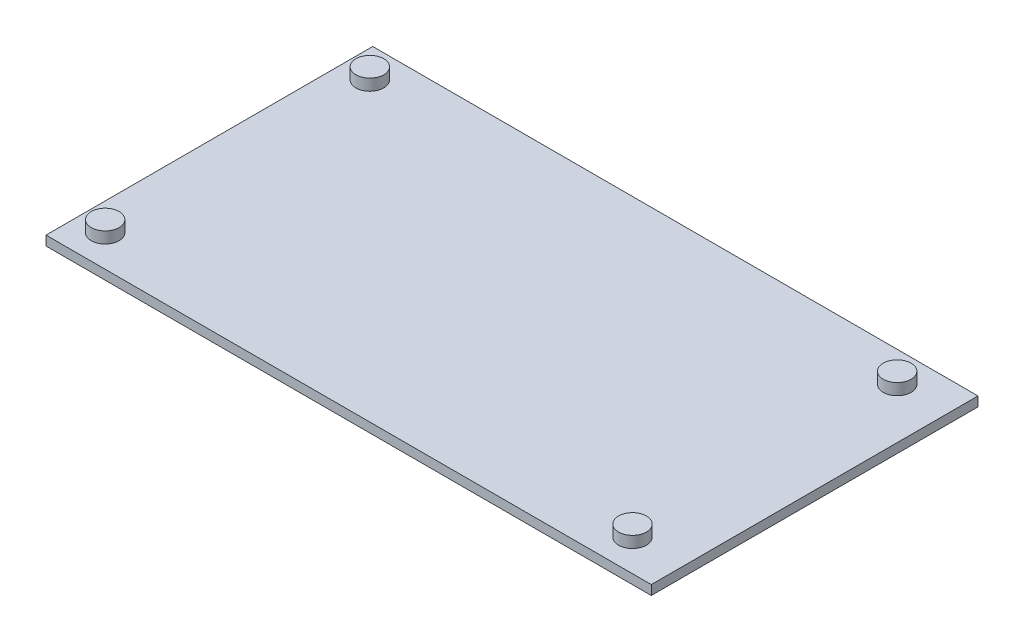
ISO-10303-21;
HEADER;
FILE_DESCRIPTION(('STEP AP214'),'2;1');
FILE_NAME('part.step','',(''),(''),'','','');
FILE_SCHEMA(('AUTOMOTIVE_DESIGN { 1 0 10303 214 1 1 1 1 }'));
ENDSEC;
DATA;
#1=APPLICATION_CONTEXT('core data for automotive mechanical design processes');
#2=APPLICATION_PROTOCOL_DEFINITION('international standard','automotive_design',2000,#1);
#3=PRODUCT_CONTEXT('',#1,'mechanical');
#4=PRODUCT('Part','Part','',(#3));
#5=PRODUCT_RELATED_PRODUCT_CATEGORY('part','',(#4));
#6=PRODUCT_DEFINITION_FORMATION('','',#4);
#7=PRODUCT_DEFINITION_CONTEXT('part definition',#1,'design');
#8=PRODUCT_DEFINITION('design','',#6,#7);
#9=PRODUCT_DEFINITION_SHAPE('','',#8);
#10=(LENGTH_UNIT() NAMED_UNIT(*) SI_UNIT(.MILLI.,.METRE.));
#11=(NAMED_UNIT(*) PLANE_ANGLE_UNIT() SI_UNIT($,.RADIAN.));
#12=(NAMED_UNIT(*) SI_UNIT($,.STERADIAN.) SOLID_ANGLE_UNIT());
#13=UNCERTAINTY_MEASURE_WITH_UNIT(LENGTH_MEASURE(1.E-05),#10,'distance_accuracy_value','');
#14=(GEOMETRIC_REPRESENTATION_CONTEXT(3) GLOBAL_UNCERTAINTY_ASSIGNED_CONTEXT((#13)) GLOBAL_UNIT_ASSIGNED_CONTEXT((#10,
#11,#12)) REPRESENTATION_CONTEXT('',''));
#15=CARTESIAN_POINT('',(0.,0.,0.));
#16=DIRECTION('',(0.,0.,1.));
#17=DIRECTION('',(1.,0.,0.));
#18=AXIS2_PLACEMENT_3D('',#15,#16,#17);
#19=CARTESIAN_POINT('',(-47.8,-111.636642068871,61.8));
#20=DIRECTION('',(1.,0.,0.));
#21=DIRECTION('',(0.,1.,0.));
#22=AXIS2_PLACEMENT_3D('',#19,#20,#21);
#23=PLANE('',#22);
#24=DIRECTION('',(0.,0.,-1.));
#25=VECTOR('',#24,1.);
#26=CARTESIAN_POINT('',(-47.8,-2.5,61.8));
#27=LINE('',#26,#25);
#28=CARTESIAN_POINT('',(-47.8,-2.5,61.8));
#29=VERTEX_POINT('',#28);
#30=CARTESIAN_POINT('',(-47.8,-2.49999999999999,10.2));
#31=VERTEX_POINT('',#30);
#32=EDGE_CURVE('E83',#29,#31,#27,.T.);
#33=ORIENTED_EDGE('',*,*,#32,.F.);
#34=DIRECTION('',(0.,1.,0.));
#35=VECTOR('',#34,1.);
#36=CARTESIAN_POINT('',(-47.8,-111.636642068871,61.8));
#37=LINE('',#36,#35);
#38=CARTESIAN_POINT('',(-47.8,-1.00000000000001,61.8));
#39=VERTEX_POINT('',#38);
#40=EDGE_CURVE('E48',#29,#39,#37,.T.);
#41=ORIENTED_EDGE('',*,*,#40,.T.);
#42=DIRECTION('',(0.,0.,-1.));
#43=VECTOR('',#42,1.);
#44=CARTESIAN_POINT('',(-47.8,-1.00000000000001,61.8));
#45=LINE('',#44,#43);
#46=CARTESIAN_POINT('',(-47.8,-1.00000000000001,10.2));
#47=VERTEX_POINT('',#46);
#48=EDGE_CURVE('E81',#39,#47,#45,.T.);
#49=ORIENTED_EDGE('',*,*,#48,.T.);
#50=DIRECTION('',(0.,1.,0.));
#51=VECTOR('',#50,1.);
#52=CARTESIAN_POINT('',(-47.8,-111.636642068871,10.2));
#53=LINE('',#52,#51);
#54=EDGE_CURVE('E71',#31,#47,#53,.T.);
#55=ORIENTED_EDGE('',*,*,#54,.F.);
#56=EDGE_LOOP('',(#33,#41,#49,#55));
#57=FACE_BOUND('',#56,.T.);
#58=ADVANCED_FACE('F33',(#57),#23,.F.);
#59=CARTESIAN_POINT('',(-47.8,-111.636642068871,10.2));
#60=DIRECTION('',(0.,0.,1.));
#61=DIRECTION('',(1.,0.,0.));
#62=AXIS2_PLACEMENT_3D('',#59,#60,#61);
#63=PLANE('',#62);
#64=DIRECTION('',(1.,0.,0.));
#65=VECTOR('',#64,1.);
#66=CARTESIAN_POINT('',(-47.8,-2.5,10.2));
#67=LINE('',#66,#65);
#68=CARTESIAN_POINT('',(47.8,-2.5,10.2));
#69=VERTEX_POINT('',#68);
#70=EDGE_CURVE('E77',#31,#69,#67,.T.);
#71=ORIENTED_EDGE('',*,*,#70,.F.);
#72=ORIENTED_EDGE('',*,*,#54,.T.);
#73=DIRECTION('',(1.,0.,0.));
#74=VECTOR('',#73,1.);
#75=CARTESIAN_POINT('',(-47.8,-1.00000000000001,10.2));
#76=LINE('',#75,#74);
#77=CARTESIAN_POINT('',(47.8,-0.999999999999993,10.2));
#78=VERTEX_POINT('',#77);
#79=EDGE_CURVE('E95',#47,#78,#76,.T.);
#80=ORIENTED_EDGE('',*,*,#79,.T.);
#81=DIRECTION('',(0.,1.,0.));
#82=VECTOR('',#81,1.);
#83=CARTESIAN_POINT('',(47.8,-111.636642068871,10.2));
#84=LINE('',#83,#82);
#85=EDGE_CURVE('E108',#69,#78,#84,.T.);
#86=ORIENTED_EDGE('',*,*,#85,.F.);
#87=EDGE_LOOP('',(#71,#72,#80,#86));
#88=FACE_BOUND('',#87,.T.);
#89=ADVANCED_FACE('F144',(#88),#63,.F.);
#90=CARTESIAN_POINT('',(47.8,-111.636642068871,61.8));
#91=DIRECTION('',(-1.,0.,0.));
#92=DIRECTION('',(0.,-1.,0.));
#93=AXIS2_PLACEMENT_3D('',#90,#91,#92);
#94=PLANE('',#93);
#95=DIRECTION('',(0.,0.,1.));
#96=VECTOR('',#95,1.);
#97=CARTESIAN_POINT('',(47.8,-2.5,61.8));
#98=LINE('',#97,#96);
#99=CARTESIAN_POINT('',(47.8,-2.5,61.8));
#100=VERTEX_POINT('',#99);
#101=EDGE_CURVE('E101',#69,#100,#98,.T.);
#102=ORIENTED_EDGE('',*,*,#101,.F.);
#103=ORIENTED_EDGE('',*,*,#85,.T.);
#104=DIRECTION('',(0.,0.,1.));
#105=VECTOR('',#104,1.);
#106=CARTESIAN_POINT('',(47.8,-0.999999999999993,61.8));
#107=LINE('',#106,#105);
#108=CARTESIAN_POINT('',(47.8,-0.999999999999993,61.8));
#109=VERTEX_POINT('',#108);
#110=EDGE_CURVE('E110',#78,#109,#107,.T.);
#111=ORIENTED_EDGE('',*,*,#110,.T.);
#112=DIRECTION('',(0.,1.,0.));
#113=VECTOR('',#112,1.);
#114=CARTESIAN_POINT('',(47.8,-111.636642068871,61.8));
#115=LINE('',#114,#113);
#116=EDGE_CURVE('E54',#100,#109,#115,.T.);
#117=ORIENTED_EDGE('',*,*,#116,.F.);
#118=EDGE_LOOP('',(#102,#103,#111,#117));
#119=FACE_BOUND('',#118,.T.);
#120=ADVANCED_FACE('F148',(#119),#94,.F.);
#121=CARTESIAN_POINT('',(-47.8,-111.636642068871,61.8));
#122=DIRECTION('',(0.,0.,-1.));
#123=DIRECTION('',(-1.,0.,0.));
#124=AXIS2_PLACEMENT_3D('',#121,#122,#123);
#125=PLANE('',#124);
#126=DIRECTION('',(-1.,0.,0.));
#127=VECTOR('',#126,1.);
#128=CARTESIAN_POINT('',(-47.8,-2.5,61.8));
#129=LINE('',#128,#127);
#130=EDGE_CURVE('E92',#100,#29,#129,.T.);
#131=ORIENTED_EDGE('',*,*,#130,.F.);
#132=ORIENTED_EDGE('',*,*,#116,.T.);
#133=DIRECTION('',(-1.,0.,0.));
#134=VECTOR('',#133,1.);
#135=CARTESIAN_POINT('',(-47.8,-1.00000000000001,61.8));
#136=LINE('',#135,#134);
#137=EDGE_CURVE('E88',#109,#39,#136,.T.);
#138=ORIENTED_EDGE('',*,*,#137,.T.);
#139=ORIENTED_EDGE('',*,*,#40,.F.);
#140=EDGE_LOOP('',(#131,#132,#138,#139));
#141=FACE_BOUND('',#140,.T.);
#142=ADVANCED_FACE('F89',(#141),#125,.F.);
#143=CARTESIAN_POINT('',(0.,-1.,0.));
#144=DIRECTION('',(0.,-1.,0.));
#145=DIRECTION('',(1.,0.,0.));
#146=AXIS2_PLACEMENT_3D('',#143,#144,#145);
#147=PLANE('',#146);
#148=CARTESIAN_POINT('',(39.8327710388283,-0.999999999999996,56.8));
#149=DIRECTION('',(0.,-1.,0.));
#150=DIRECTION('',(1.,0.,0.));
#151=AXIS2_PLACEMENT_3D('',#148,#149,#150);
#152=CIRCLE('',#151,2.2);
#153=CARTESIAN_POINT('',(42.0327710388283,-0.999999999999996,56.8));
#154=VERTEX_POINT('',#153);
#155=EDGE_CURVE('E11',#154,#154,#152,.F.);
#156=ORIENTED_EDGE('',*,*,#155,.F.);
#157=EDGE_LOOP('',(#156));
#158=FACE_BOUND('',#157,.T.);
#159=CARTESIAN_POINT('',(39.8327710388283,-0.999999999999996,15.));
#160=DIRECTION('',(0.,-1.,0.));
#161=DIRECTION('',(1.,0.,0.));
#162=AXIS2_PLACEMENT_3D('',#159,#160,#161);
#163=CIRCLE('',#162,2.2);
#164=CARTESIAN_POINT('',(42.0327710388283,-0.999999999999996,15.));
#165=VERTEX_POINT('',#164);
#166=EDGE_CURVE('E41',#165,#165,#163,.F.);
#167=ORIENTED_EDGE('',*,*,#166,.F.);
#168=EDGE_LOOP('',(#167));
#169=FACE_BOUND('',#168,.T.);
#170=CARTESIAN_POINT('',(-43.4539320423583,-1.00000000000001,15.));
#171=DIRECTION('',(0.,-1.,0.));
#172=DIRECTION('',(1.,0.,0.));
#173=AXIS2_PLACEMENT_3D('',#170,#171,#172);
#174=CIRCLE('',#173,2.2);
#175=CARTESIAN_POINT('',(-41.2539320423583,-1.,15.));
#176=VERTEX_POINT('',#175);
#177=EDGE_CURVE('E114',#176,#176,#174,.F.);
#178=ORIENTED_EDGE('',*,*,#177,.F.);
#179=EDGE_LOOP('',(#178));
#180=FACE_BOUND('',#179,.T.);
#181=CARTESIAN_POINT('',(-43.4539320423583,-1.00000000000001,56.8));
#182=DIRECTION('',(0.,-1.,0.));
#183=DIRECTION('',(1.,0.,0.));
#184=AXIS2_PLACEMENT_3D('',#181,#182,#183);
#185=CIRCLE('',#184,2.2);
#186=CARTESIAN_POINT('',(-41.2539320423583,-1.,56.8));
#187=VERTEX_POINT('',#186);
#188=EDGE_CURVE('E104',#187,#187,#185,.F.);
#189=ORIENTED_EDGE('',*,*,#188,.F.);
#190=EDGE_LOOP('',(#189));
#191=FACE_BOUND('',#190,.T.);
#192=ORIENTED_EDGE('',*,*,#48,.F.);
#193=ORIENTED_EDGE('',*,*,#137,.F.);
#194=ORIENTED_EDGE('',*,*,#110,.F.);
#195=ORIENTED_EDGE('',*,*,#79,.F.);
#196=EDGE_LOOP('',(#192,#193,#194,#195));
#197=FACE_BOUND('',#196,.T.);
#198=ADVANCED_FACE('F94',(#158,#169,#180,#191,#197),#147,.F.);
#199=CARTESIAN_POINT('',(0.,-2.5,34.));
#200=DIRECTION('',(0.,-1.,0.));
#201=DIRECTION('',(1.,0.,0.));
#202=AXIS2_PLACEMENT_3D('',#199,#200,#201);
#203=PLANE('',#202);
#204=ORIENTED_EDGE('',*,*,#130,.T.);
#205=ORIENTED_EDGE('',*,*,#32,.T.);
#206=ORIENTED_EDGE('',*,*,#70,.T.);
#207=ORIENTED_EDGE('',*,*,#101,.T.);
#208=EDGE_LOOP('',(#204,#205,#206,#207));
#209=FACE_BOUND('',#208,.T.);
#210=ADVANCED_FACE('F35',(#209),#203,.T.);
#211=CARTESIAN_POINT('',(-43.4539320423583,9.22253967444161,56.8));
#212=DIRECTION('',(0.,-1.,0.));
#213=DIRECTION('',(1.,0.,0.));
#214=AXIS2_PLACEMENT_3D('',#211,#212,#213);
#215=CYLINDRICAL_SURFACE('',#214,2.2);
#216=CARTESIAN_POINT('',(-43.4539320423583,0.799999999999995,56.8));
#217=DIRECTION('',(0.,-1.,0.));
#218=DIRECTION('',(1.,0.,0.));
#219=AXIS2_PLACEMENT_3D('',#216,#217,#218);
#220=CIRCLE('',#219,2.2);
#221=CARTESIAN_POINT('',(-41.2539320423583,0.799999999999995,56.8));
#222=VERTEX_POINT('',#221);
#223=EDGE_CURVE('E85',#222,#222,#220,.T.);
#224=CARTESIAN_POINT('',(-41.2539320423583,0.799999999999995,56.8));
#225=CARTESIAN_POINT('',(-41.2539320423583,0.781249999999995,56.8));
#226=CARTESIAN_POINT('',(-41.2539320423583,0.762499999999995,56.8));
#227=CARTESIAN_POINT('',(-41.2539320423583,0.724999999999995,56.8));
#228=CARTESIAN_POINT('',(-41.2539320423583,0.706249999999995,56.8));
#229=CARTESIAN_POINT('',(-41.2539320423583,0.668749999999995,56.8));
#230=CARTESIAN_POINT('',(-41.2539320423583,0.649999999999995,56.8));
#231=CARTESIAN_POINT('',(-41.2539320423583,0.612499999999995,56.8));
#232=CARTESIAN_POINT('',(-41.2539320423583,0.593749999999995,56.8));
#233=CARTESIAN_POINT('',(-41.2539320423583,0.556249999999995,56.8));
#234=CARTESIAN_POINT('',(-41.2539320423583,0.537499999999995,56.8));
#235=CARTESIAN_POINT('',(-41.2539320423583,0.499999999999995,56.8));
#236=CARTESIAN_POINT('',(-41.2539320423583,0.481249999999996,56.8));
#237=CARTESIAN_POINT('',(-41.2539320423583,0.443749999999996,56.8));
#238=CARTESIAN_POINT('',(-41.2539320423583,0.424999999999995,56.8));
#239=CARTESIAN_POINT('',(-41.2539320423583,0.387499999999996,56.8));
#240=CARTESIAN_POINT('',(-41.2539320423583,0.368749999999996,56.8));
#241=CARTESIAN_POINT('',(-41.2539320423583,0.331249999999996,56.8));
#242=CARTESIAN_POINT('',(-41.2539320423583,0.312499999999996,56.8));
#243=CARTESIAN_POINT('',(-41.2539320423583,0.274999999999995,56.8));
#244=CARTESIAN_POINT('',(-41.2539320423583,0.256249999999995,56.8));
#245=CARTESIAN_POINT('',(-41.2539320423583,0.218749999999995,56.8));
#246=CARTESIAN_POINT('',(-41.2539320423583,0.199999999999995,56.8));
#247=CARTESIAN_POINT('',(-41.2539320423583,0.162499999999995,56.8));
#248=CARTESIAN_POINT('',(-41.2539320423583,0.143749999999995,56.8));
#249=CARTESIAN_POINT('',(-41.2539320423583,0.106249999999995,56.8));
#250=CARTESIAN_POINT('',(-41.2539320423583,0.0874999999999956,56.8));
#251=CARTESIAN_POINT('',(-41.2539320423583,0.0499999999999956,56.8));
#252=CARTESIAN_POINT('',(-41.2539320423583,0.0312499999999954,56.8));
#253=CARTESIAN_POINT('',(-41.2539320423583,-0.00625000000000451,56.8));
#254=CARTESIAN_POINT('',(-41.2539320423583,-0.0250000000000042,56.8));
#255=CARTESIAN_POINT('',(-41.2539320423583,-0.0625000000000041,56.8));
#256=CARTESIAN_POINT('',(-41.2539320423583,-0.0812500000000044,56.8));
#257=CARTESIAN_POINT('',(-41.2539320423583,-0.118750000000005,56.8));
#258=CARTESIAN_POINT('',(-41.2539320423583,-0.137500000000005,56.8));
#259=CARTESIAN_POINT('',(-41.2539320423583,-0.175000000000005,56.8));
#260=CARTESIAN_POINT('',(-41.2539320423583,-0.193750000000005,56.8));
#261=CARTESIAN_POINT('',(-41.2539320423583,-0.231250000000005,56.8));
#262=CARTESIAN_POINT('',(-41.2539320423583,-0.250000000000005,56.8));
#263=CARTESIAN_POINT('',(-41.2539320423583,-0.287500000000005,56.8));
#264=CARTESIAN_POINT('',(-41.2539320423583,-0.306250000000004,56.8));
#265=CARTESIAN_POINT('',(-41.2539320423583,-0.343750000000004,56.8));
#266=CARTESIAN_POINT('',(-41.2539320423583,-0.362500000000005,56.8));
#267=CARTESIAN_POINT('',(-41.2539320423583,-0.400000000000005,56.8));
#268=CARTESIAN_POINT('',(-41.2539320423583,-0.418750000000004,56.8));
#269=CARTESIAN_POINT('',(-41.2539320423583,-0.456250000000004,56.8));
#270=CARTESIAN_POINT('',(-41.2539320423583,-0.475000000000004,56.8));
#271=CARTESIAN_POINT('',(-41.2539320423583,-0.512500000000005,56.8));
#272=CARTESIAN_POINT('',(-41.2539320423583,-0.531250000000005,56.8));
#273=CARTESIAN_POINT('',(-41.2539320423583,-0.568750000000005,56.8));
#274=CARTESIAN_POINT('',(-41.2539320423583,-0.587500000000005,56.8));
#275=CARTESIAN_POINT('',(-41.2539320423583,-0.625000000000005,56.8));
#276=CARTESIAN_POINT('',(-41.2539320423583,-0.643750000000005,56.8));
#277=CARTESIAN_POINT('',(-41.2539320423583,-0.681250000000005,56.8));
#278=CARTESIAN_POINT('',(-41.2539320423583,-0.700000000000004,56.8));
#279=CARTESIAN_POINT('',(-41.2539320423583,-0.737500000000004,56.8));
#280=CARTESIAN_POINT('',(-41.2539320423583,-0.756250000000005,56.8));
#281=CARTESIAN_POINT('',(-41.2539320423583,-0.793750000000005,56.8));
#282=CARTESIAN_POINT('',(-41.2539320423583,-0.812500000000004,56.8));
#283=CARTESIAN_POINT('',(-41.2539320423583,-0.850000000000004,56.8));
#284=CARTESIAN_POINT('',(-41.2539320423583,-0.868750000000004,56.8));
#285=CARTESIAN_POINT('',(-41.2539320423583,-0.906250000000004,56.8));
#286=CARTESIAN_POINT('',(-41.2539320423583,-0.925000000000004,56.8));
#287=CARTESIAN_POINT('',(-41.2539320423583,-0.962500000000004,56.8));
#288=CARTESIAN_POINT('',(-41.2539320423583,-0.981250000000004,56.8));
#289=CARTESIAN_POINT('',(-41.2539320423583,-1.,56.8));
#290=B_SPLINE_CURVE_WITH_KNOTS('',3,(#224,#225,#226,#227,#228,#229,#230,#231,#232,#233,#234,
#235,#236,#237,#238,#239,#240,#241,#242,#243,#244,#245,#246,#247,#248,#249,#250,#251,#252,#253,
#254,#255,#256,#257,#258,#259,#260,#261,#262,#263,#264,#265,#266,#267,#268,#269,#270,#271,#272,
#273,#274,#275,#276,#277,#278,#279,#280,#281,#282,#283,#284,#285,#286,#287,#288,#289),
.UNSPECIFIED.,.F.,.F.,(4,2,2,2,2,2,2,2,2,2,2,2,2,2,2,2,2,2,2,2,2,2,2,2,2,2,2,2,2,2,2,2,4),(0.,
0.0562500000000007,0.1125,0.168750000000001,0.225,0.28125,0.337499999999999,0.39375,
0.449999999999999,0.50625,0.5625,0.618749999999999,0.675,0.731249999999999,0.7875,
0.843749999999999,0.9,0.95625,1.0125,1.06875,1.125,1.18125,1.2375,1.29375,1.35,1.40625,1.4625,
1.51875,1.575,1.63125,1.6875,1.74375,1.8),.UNSPECIFIED.);
#291=EDGE_CURVE('BSEAM129',#222,#187,#290,.T.);
#292=ORIENTED_EDGE('',*,*,#223,.T.);
#293=ORIENTED_EDGE('',*,*,#188,.T.);
#294=ORIENTED_EDGE('',*,*,#291,.T.);
#295=ORIENTED_EDGE('',*,*,#291,.F.);
#296=EDGE_LOOP('',(#292,#294,#293,#295));
#297=FACE_BOUND('',#296,.T.);
#298=ADVANCED_FACE('F129',(#297),#215,.T.);
#299=CARTESIAN_POINT('',(0.,0.8,34.));
#300=DIRECTION('',(0.,-1.,0.));
#301=DIRECTION('',(1.,0.,0.));
#302=AXIS2_PLACEMENT_3D('',#299,#300,#301);
#303=PLANE('',#302);
#304=ORIENTED_EDGE('',*,*,#223,.F.);
#305=EDGE_LOOP('',(#304));
#306=FACE_BOUND('',#305,.T.);
#307=ADVANCED_FACE('F131',(#306),#303,.F.);
#308=CARTESIAN_POINT('',(-43.4539320423583,9.22253967444161,15.));
#309=DIRECTION('',(0.,-1.,0.));
#310=DIRECTION('',(1.,0.,0.));
#311=AXIS2_PLACEMENT_3D('',#308,#309,#310);
#312=CYLINDRICAL_SURFACE('',#311,2.2);
#313=CARTESIAN_POINT('',(-43.4539320423583,0.799999999999995,15.));
#314=DIRECTION('',(0.,-1.,0.));
#315=DIRECTION('',(1.,0.,0.));
#316=AXIS2_PLACEMENT_3D('',#313,#314,#315);
#317=CIRCLE('',#316,2.2);
#318=CARTESIAN_POINT('',(-41.2539320423583,0.799999999999995,15.));
#319=VERTEX_POINT('',#318);
#320=EDGE_CURVE('E247',#319,#319,#317,.T.);
#321=CARTESIAN_POINT('',(-41.2539320423583,0.799999999999995,15.));
#322=CARTESIAN_POINT('',(-41.2539320423583,0.781249999999995,15.));
#323=CARTESIAN_POINT('',(-41.2539320423583,0.762499999999995,15.));
#324=CARTESIAN_POINT('',(-41.2539320423583,0.724999999999995,15.));
#325=CARTESIAN_POINT('',(-41.2539320423583,0.706249999999995,15.));
#326=CARTESIAN_POINT('',(-41.2539320423583,0.668749999999995,15.));
#327=CARTESIAN_POINT('',(-41.2539320423583,0.649999999999995,15.));
#328=CARTESIAN_POINT('',(-41.2539320423583,0.612499999999995,15.));
#329=CARTESIAN_POINT('',(-41.2539320423583,0.593749999999995,15.));
#330=CARTESIAN_POINT('',(-41.2539320423583,0.556249999999995,15.));
#331=CARTESIAN_POINT('',(-41.2539320423583,0.537499999999995,15.));
#332=CARTESIAN_POINT('',(-41.2539320423583,0.499999999999995,15.));
#333=CARTESIAN_POINT('',(-41.2539320423583,0.481249999999996,15.));
#334=CARTESIAN_POINT('',(-41.2539320423583,0.443749999999996,15.));
#335=CARTESIAN_POINT('',(-41.2539320423583,0.424999999999995,15.));
#336=CARTESIAN_POINT('',(-41.2539320423583,0.387499999999996,15.));
#337=CARTESIAN_POINT('',(-41.2539320423583,0.368749999999996,15.));
#338=CARTESIAN_POINT('',(-41.2539320423583,0.331249999999996,15.));
#339=CARTESIAN_POINT('',(-41.2539320423583,0.312499999999996,15.));
#340=CARTESIAN_POINT('',(-41.2539320423583,0.274999999999995,15.));
#341=CARTESIAN_POINT('',(-41.2539320423583,0.256249999999995,15.));
#342=CARTESIAN_POINT('',(-41.2539320423583,0.218749999999995,15.));
#343=CARTESIAN_POINT('',(-41.2539320423583,0.199999999999995,15.));
#344=CARTESIAN_POINT('',(-41.2539320423583,0.162499999999995,15.));
#345=CARTESIAN_POINT('',(-41.2539320423583,0.143749999999995,15.));
#346=CARTESIAN_POINT('',(-41.2539320423583,0.106249999999995,15.));
#347=CARTESIAN_POINT('',(-41.2539320423583,0.0874999999999956,15.));
#348=CARTESIAN_POINT('',(-41.2539320423583,0.0499999999999956,15.));
#349=CARTESIAN_POINT('',(-41.2539320423583,0.0312499999999954,15.));
#350=CARTESIAN_POINT('',(-41.2539320423583,-0.00625000000000451,15.));
#351=CARTESIAN_POINT('',(-41.2539320423583,-0.0250000000000042,15.));
#352=CARTESIAN_POINT('',(-41.2539320423583,-0.0625000000000041,15.));
#353=CARTESIAN_POINT('',(-41.2539320423583,-0.0812500000000044,15.));
#354=CARTESIAN_POINT('',(-41.2539320423583,-0.118750000000005,15.));
#355=CARTESIAN_POINT('',(-41.2539320423583,-0.137500000000005,15.));
#356=CARTESIAN_POINT('',(-41.2539320423583,-0.175000000000005,15.));
#357=CARTESIAN_POINT('',(-41.2539320423583,-0.193750000000005,15.));
#358=CARTESIAN_POINT('',(-41.2539320423583,-0.231250000000005,15.));
#359=CARTESIAN_POINT('',(-41.2539320423583,-0.250000000000005,15.));
#360=CARTESIAN_POINT('',(-41.2539320423583,-0.287500000000005,15.));
#361=CARTESIAN_POINT('',(-41.2539320423583,-0.306250000000004,15.));
#362=CARTESIAN_POINT('',(-41.2539320423583,-0.343750000000004,15.));
#363=CARTESIAN_POINT('',(-41.2539320423583,-0.362500000000005,15.));
#364=CARTESIAN_POINT('',(-41.2539320423583,-0.400000000000005,15.));
#365=CARTESIAN_POINT('',(-41.2539320423583,-0.418750000000004,15.));
#366=CARTESIAN_POINT('',(-41.2539320423583,-0.456250000000004,15.));
#367=CARTESIAN_POINT('',(-41.2539320423583,-0.475000000000004,15.));
#368=CARTESIAN_POINT('',(-41.2539320423583,-0.512500000000005,15.));
#369=CARTESIAN_POINT('',(-41.2539320423583,-0.531250000000005,15.));
#370=CARTESIAN_POINT('',(-41.2539320423583,-0.568750000000005,15.));
#371=CARTESIAN_POINT('',(-41.2539320423583,-0.587500000000005,15.));
#372=CARTESIAN_POINT('',(-41.2539320423583,-0.625000000000005,15.));
#373=CARTESIAN_POINT('',(-41.2539320423583,-0.643750000000005,15.));
#374=CARTESIAN_POINT('',(-41.2539320423583,-0.681250000000005,15.));
#375=CARTESIAN_POINT('',(-41.2539320423583,-0.700000000000004,15.));
#376=CARTESIAN_POINT('',(-41.2539320423583,-0.737500000000004,15.));
#377=CARTESIAN_POINT('',(-41.2539320423583,-0.756250000000005,15.));
#378=CARTESIAN_POINT('',(-41.2539320423583,-0.793750000000005,15.));
#379=CARTESIAN_POINT('',(-41.2539320423583,-0.812500000000004,15.));
#380=CARTESIAN_POINT('',(-41.2539320423583,-0.850000000000004,15.));
#381=CARTESIAN_POINT('',(-41.2539320423583,-0.868750000000004,15.));
#382=CARTESIAN_POINT('',(-41.2539320423583,-0.906250000000004,15.));
#383=CARTESIAN_POINT('',(-41.2539320423583,-0.925000000000004,15.));
#384=CARTESIAN_POINT('',(-41.2539320423583,-0.962500000000004,15.));
#385=CARTESIAN_POINT('',(-41.2539320423583,-0.981250000000004,15.));
#386=CARTESIAN_POINT('',(-41.2539320423583,-1.,15.));
#387=B_SPLINE_CURVE_WITH_KNOTS('',3,(#321,#322,#323,#324,#325,#326,#327,#328,#329,#330,#331,
#332,#333,#334,#335,#336,#337,#338,#339,#340,#341,#342,#343,#344,#345,#346,#347,#348,#349,#350,
#351,#352,#353,#354,#355,#356,#357,#358,#359,#360,#361,#362,#363,#364,#365,#366,#367,#368,#369,
#370,#371,#372,#373,#374,#375,#376,#377,#378,#379,#380,#381,#382,#383,#384,#385,#386),
.UNSPECIFIED.,.F.,.F.,(4,2,2,2,2,2,2,2,2,2,2,2,2,2,2,2,2,2,2,2,2,2,2,2,2,2,2,2,2,2,2,2,4),(0.,
0.0562500000000007,0.1125,0.168750000000001,0.225,0.28125,0.337499999999999,0.39375,
0.449999999999999,0.50625,0.5625,0.618749999999999,0.675,0.731249999999999,0.7875,
0.843749999999999,0.9,0.95625,1.0125,1.06875,1.125,1.18125,1.2375,1.29375,1.35,1.40625,1.4625,
1.51875,1.575,1.63125,1.6875,1.74375,1.8),.UNSPECIFIED.);
#388=EDGE_CURVE('BSEAM138',#319,#176,#387,.T.);
#389=ORIENTED_EDGE('',*,*,#320,.T.);
#390=ORIENTED_EDGE('',*,*,#177,.T.);
#391=ORIENTED_EDGE('',*,*,#388,.T.);
#392=ORIENTED_EDGE('',*,*,#388,.F.);
#393=EDGE_LOOP('',(#389,#391,#390,#392));
#394=FACE_BOUND('',#393,.T.);
#395=ADVANCED_FACE('F138',(#394),#312,.T.);
#396=CARTESIAN_POINT('',(0.,0.8,34.));
#397=DIRECTION('',(0.,-1.,0.));
#398=DIRECTION('',(1.,0.,0.));
#399=AXIS2_PLACEMENT_3D('',#396,#397,#398);
#400=PLANE('',#399);
#401=ORIENTED_EDGE('',*,*,#320,.F.);
#402=EDGE_LOOP('',(#401));
#403=FACE_BOUND('',#402,.T.);
#404=ADVANCED_FACE('F188',(#403),#400,.F.);
#405=CARTESIAN_POINT('',(39.8327710388283,9.22253967444163,15.));
#406=DIRECTION('',(0.,-1.,0.));
#407=DIRECTION('',(1.,0.,0.));
#408=AXIS2_PLACEMENT_3D('',#405,#406,#407);
#409=CYLINDRICAL_SURFACE('',#408,2.2);
#410=CARTESIAN_POINT('',(39.8327710388283,0.800000000000006,15.));
#411=DIRECTION('',(0.,-1.,0.));
#412=DIRECTION('',(1.,0.,0.));
#413=AXIS2_PLACEMENT_3D('',#410,#411,#412);
#414=CIRCLE('',#413,2.2);
#415=CARTESIAN_POINT('',(42.0327710388283,0.800000000000007,15.));
#416=VERTEX_POINT('',#415);
#417=EDGE_CURVE('E244',#416,#416,#414,.T.);
#418=CARTESIAN_POINT('',(42.0327710388283,0.800000000000007,15.));
#419=CARTESIAN_POINT('',(42.0327710388283,0.781250000000007,15.));
#420=CARTESIAN_POINT('',(42.0327710388283,0.762500000000007,15.));
#421=CARTESIAN_POINT('',(42.0327710388283,0.725000000000007,15.));
#422=CARTESIAN_POINT('',(42.0327710388283,0.706250000000007,15.));
#423=CARTESIAN_POINT('',(42.0327710388283,0.668750000000007,15.));
#424=CARTESIAN_POINT('',(42.0327710388283,0.650000000000007,15.));
#425=CARTESIAN_POINT('',(42.0327710388283,0.612500000000007,15.));
#426=CARTESIAN_POINT('',(42.0327710388283,0.593750000000007,15.));
#427=CARTESIAN_POINT('',(42.0327710388283,0.556250000000008,15.));
#428=CARTESIAN_POINT('',(42.0327710388283,0.537500000000007,15.));
#429=CARTESIAN_POINT('',(42.0327710388283,0.500000000000007,15.));
#430=CARTESIAN_POINT('',(42.0327710388283,0.481250000000007,15.));
#431=CARTESIAN_POINT('',(42.0327710388283,0.443750000000007,15.));
#432=CARTESIAN_POINT('',(42.0327710388283,0.425000000000007,15.));
#433=CARTESIAN_POINT('',(42.0327710388283,0.387500000000007,15.));
#434=CARTESIAN_POINT('',(42.0327710388283,0.368750000000007,15.));
#435=CARTESIAN_POINT('',(42.0327710388283,0.331250000000006,15.));
#436=CARTESIAN_POINT('',(42.0327710388283,0.312500000000006,15.));
#437=CARTESIAN_POINT('',(42.0327710388283,0.275000000000006,15.));
#438=CARTESIAN_POINT('',(42.0327710388283,0.256250000000006,15.));
#439=CARTESIAN_POINT('',(42.0327710388283,0.218750000000007,15.));
#440=CARTESIAN_POINT('',(42.0327710388283,0.200000000000006,15.));
#441=CARTESIAN_POINT('',(42.0327710388283,0.162500000000006,15.));
#442=CARTESIAN_POINT('',(42.0327710388283,0.143750000000006,15.));
#443=CARTESIAN_POINT('',(42.0327710388283,0.106250000000006,15.));
#444=CARTESIAN_POINT('',(42.0327710388283,0.087500000000006,15.));
#445=CARTESIAN_POINT('',(42.0327710388283,0.0500000000000061,15.));
#446=CARTESIAN_POINT('',(42.0327710388283,0.0312500000000058,15.));
#447=CARTESIAN_POINT('',(42.0327710388283,-0.0062499999999941,15.));
#448=CARTESIAN_POINT('',(42.0327710388283,-0.0249999999999938,15.));
#449=CARTESIAN_POINT('',(42.0327710388283,-0.0624999999999937,15.));
#450=CARTESIAN_POINT('',(42.0327710388283,-0.081249999999994,15.));
#451=CARTESIAN_POINT('',(42.0327710388283,-0.118749999999994,15.));
#452=CARTESIAN_POINT('',(42.0327710388283,-0.137499999999995,15.));
#453=CARTESIAN_POINT('',(42.0327710388283,-0.174999999999995,15.));
#454=CARTESIAN_POINT('',(42.0327710388283,-0.193749999999994,15.));
#455=CARTESIAN_POINT('',(42.0327710388283,-0.231249999999994,15.));
#456=CARTESIAN_POINT('',(42.0327710388283,-0.249999999999994,15.));
#457=CARTESIAN_POINT('',(42.0327710388283,-0.287499999999994,15.));
#458=CARTESIAN_POINT('',(42.0327710388283,-0.306249999999994,15.));
#459=CARTESIAN_POINT('',(42.0327710388283,-0.343749999999994,15.));
#460=CARTESIAN_POINT('',(42.0327710388283,-0.362499999999994,15.));
#461=CARTESIAN_POINT('',(42.0327710388283,-0.399999999999995,15.));
#462=CARTESIAN_POINT('',(42.0327710388283,-0.418749999999995,15.));
#463=CARTESIAN_POINT('',(42.0327710388283,-0.456249999999995,15.));
#464=CARTESIAN_POINT('',(42.0327710388283,-0.474999999999995,15.));
#465=CARTESIAN_POINT('',(42.0327710388283,-0.512499999999994,15.));
#466=CARTESIAN_POINT('',(42.0327710388283,-0.531249999999995,15.));
#467=CARTESIAN_POINT('',(42.0327710388283,-0.568749999999995,15.));
#468=CARTESIAN_POINT('',(42.0327710388283,-0.587499999999995,15.));
#469=CARTESIAN_POINT('',(42.0327710388283,-0.624999999999995,15.));
#470=CARTESIAN_POINT('',(42.0327710388283,-0.643749999999995,15.));
#471=CARTESIAN_POINT('',(42.0327710388283,-0.681249999999995,15.));
#472=CARTESIAN_POINT('',(42.0327710388283,-0.699999999999995,15.));
#473=CARTESIAN_POINT('',(42.0327710388283,-0.737499999999996,15.));
#474=CARTESIAN_POINT('',(42.0327710388283,-0.756249999999996,15.));
#475=CARTESIAN_POINT('',(42.0327710388283,-0.793749999999996,15.));
#476=CARTESIAN_POINT('',(42.0327710388283,-0.812499999999996,15.));
#477=CARTESIAN_POINT('',(42.0327710388283,-0.849999999999995,15.));
#478=CARTESIAN_POINT('',(42.0327710388283,-0.868749999999996,15.));
#479=CARTESIAN_POINT('',(42.0327710388283,-0.906249999999996,15.));
#480=CARTESIAN_POINT('',(42.0327710388283,-0.924999999999995,15.));
#481=CARTESIAN_POINT('',(42.0327710388283,-0.962499999999995,15.));
#482=CARTESIAN_POINT('',(42.0327710388283,-0.981249999999995,15.));
#483=CARTESIAN_POINT('',(42.0327710388283,-0.999999999999996,15.));
#484=B_SPLINE_CURVE_WITH_KNOTS('',3,(#418,#419,#420,#421,#422,#423,#424,#425,#426,#427,#428,
#429,#430,#431,#432,#433,#434,#435,#436,#437,#438,#439,#440,#441,#442,#443,#444,#445,#446,#447,
#448,#449,#450,#451,#452,#453,#454,#455,#456,#457,#458,#459,#460,#461,#462,#463,#464,#465,#466,
#467,#468,#469,#470,#471,#472,#473,#474,#475,#476,#477,#478,#479,#480,#481,#482,#483),
.UNSPECIFIED.,.F.,.F.,(4,2,2,2,2,2,2,2,2,2,2,2,2,2,2,2,2,2,2,2,2,2,2,2,2,2,2,2,2,2,2,2,4),(0.,
0.0562500000000007,0.1125,0.168750000000001,0.225,0.28125,0.337500000000001,0.39375,
0.450000000000001,0.506250000000002,0.5625,0.618750000000001,0.675000000000002,
0.731250000000001,0.787500000000002,0.843750000000001,0.900000000000001,0.956250000000002,
1.0125,1.06875,1.125,1.18125,1.2375,1.29375,1.35,1.40625,1.4625,1.51875,1.575,1.63125,1.6875,
1.74375,1.8),.UNSPECIFIED.);
#485=EDGE_CURVE('BSEAM119',#416,#165,#484,.T.);
#486=ORIENTED_EDGE('',*,*,#417,.T.);
#487=ORIENTED_EDGE('',*,*,#166,.T.);
#488=ORIENTED_EDGE('',*,*,#485,.T.);
#489=ORIENTED_EDGE('',*,*,#485,.F.);
#490=EDGE_LOOP('',(#486,#488,#487,#489));
#491=FACE_BOUND('',#490,.T.);
#492=ADVANCED_FACE('F119',(#491),#409,.T.);
#493=CARTESIAN_POINT('',(0.,0.8,34.));
#494=DIRECTION('',(0.,-1.,0.));
#495=DIRECTION('',(1.,0.,0.));
#496=AXIS2_PLACEMENT_3D('',#493,#494,#495);
#497=PLANE('',#496);
#498=ORIENTED_EDGE('',*,*,#417,.F.);
#499=EDGE_LOOP('',(#498));
#500=FACE_BOUND('',#499,.T.);
#501=ADVANCED_FACE('F205',(#500),#497,.F.);
#502=CARTESIAN_POINT('',(39.8327710388283,9.22253967444163,56.8));
#503=DIRECTION('',(0.,-1.,0.));
#504=DIRECTION('',(1.,0.,0.));
#505=AXIS2_PLACEMENT_3D('',#502,#503,#504);
#506=CYLINDRICAL_SURFACE('',#505,2.2);
#507=CARTESIAN_POINT('',(39.8327710388283,0.800000000000006,56.8));
#508=DIRECTION('',(0.,-1.,0.));
#509=DIRECTION('',(1.,0.,0.));
#510=AXIS2_PLACEMENT_3D('',#507,#508,#509);
#511=CIRCLE('',#510,2.2);
#512=CARTESIAN_POINT('',(42.0327710388283,0.800000000000007,56.8));
#513=VERTEX_POINT('',#512);
#514=EDGE_CURVE('E243',#513,#513,#511,.T.);
#515=CARTESIAN_POINT('',(42.0327710388283,0.800000000000007,56.8));
#516=CARTESIAN_POINT('',(42.0327710388283,0.781250000000007,56.8));
#517=CARTESIAN_POINT('',(42.0327710388283,0.762500000000007,56.8));
#518=CARTESIAN_POINT('',(42.0327710388283,0.725000000000007,56.8));
#519=CARTESIAN_POINT('',(42.0327710388283,0.706250000000007,56.8));
#520=CARTESIAN_POINT('',(42.0327710388283,0.668750000000007,56.8));
#521=CARTESIAN_POINT('',(42.0327710388283,0.650000000000007,56.8));
#522=CARTESIAN_POINT('',(42.0327710388283,0.612500000000007,56.8));
#523=CARTESIAN_POINT('',(42.0327710388283,0.593750000000007,56.8));
#524=CARTESIAN_POINT('',(42.0327710388283,0.556250000000008,56.8));
#525=CARTESIAN_POINT('',(42.0327710388283,0.537500000000007,56.8));
#526=CARTESIAN_POINT('',(42.0327710388283,0.500000000000007,56.8));
#527=CARTESIAN_POINT('',(42.0327710388283,0.481250000000007,56.8));
#528=CARTESIAN_POINT('',(42.0327710388283,0.443750000000007,56.8));
#529=CARTESIAN_POINT('',(42.0327710388283,0.425000000000007,56.8));
#530=CARTESIAN_POINT('',(42.0327710388283,0.387500000000007,56.8));
#531=CARTESIAN_POINT('',(42.0327710388283,0.368750000000007,56.8));
#532=CARTESIAN_POINT('',(42.0327710388283,0.331250000000006,56.8));
#533=CARTESIAN_POINT('',(42.0327710388283,0.312500000000006,56.8));
#534=CARTESIAN_POINT('',(42.0327710388283,0.275000000000006,56.8));
#535=CARTESIAN_POINT('',(42.0327710388283,0.256250000000006,56.8));
#536=CARTESIAN_POINT('',(42.0327710388283,0.218750000000007,56.8));
#537=CARTESIAN_POINT('',(42.0327710388283,0.200000000000006,56.8));
#538=CARTESIAN_POINT('',(42.0327710388283,0.162500000000006,56.8));
#539=CARTESIAN_POINT('',(42.0327710388283,0.143750000000006,56.8));
#540=CARTESIAN_POINT('',(42.0327710388283,0.106250000000006,56.8));
#541=CARTESIAN_POINT('',(42.0327710388283,0.087500000000006,56.8));
#542=CARTESIAN_POINT('',(42.0327710388283,0.0500000000000061,56.8));
#543=CARTESIAN_POINT('',(42.0327710388283,0.0312500000000058,56.8));
#544=CARTESIAN_POINT('',(42.0327710388283,-0.0062499999999941,56.8));
#545=CARTESIAN_POINT('',(42.0327710388283,-0.0249999999999938,56.8));
#546=CARTESIAN_POINT('',(42.0327710388283,-0.0624999999999937,56.8));
#547=CARTESIAN_POINT('',(42.0327710388283,-0.081249999999994,56.8));
#548=CARTESIAN_POINT('',(42.0327710388283,-0.118749999999994,56.8));
#549=CARTESIAN_POINT('',(42.0327710388283,-0.137499999999995,56.8));
#550=CARTESIAN_POINT('',(42.0327710388283,-0.174999999999995,56.8));
#551=CARTESIAN_POINT('',(42.0327710388283,-0.193749999999994,56.8));
#552=CARTESIAN_POINT('',(42.0327710388283,-0.231249999999994,56.8));
#553=CARTESIAN_POINT('',(42.0327710388283,-0.249999999999994,56.8));
#554=CARTESIAN_POINT('',(42.0327710388283,-0.287499999999994,56.8));
#555=CARTESIAN_POINT('',(42.0327710388283,-0.306249999999994,56.8));
#556=CARTESIAN_POINT('',(42.0327710388283,-0.343749999999994,56.8));
#557=CARTESIAN_POINT('',(42.0327710388283,-0.362499999999994,56.8));
#558=CARTESIAN_POINT('',(42.0327710388283,-0.399999999999995,56.8));
#559=CARTESIAN_POINT('',(42.0327710388283,-0.418749999999995,56.8));
#560=CARTESIAN_POINT('',(42.0327710388283,-0.456249999999995,56.8));
#561=CARTESIAN_POINT('',(42.0327710388283,-0.474999999999995,56.8));
#562=CARTESIAN_POINT('',(42.0327710388283,-0.512499999999994,56.8));
#563=CARTESIAN_POINT('',(42.0327710388283,-0.531249999999995,56.8));
#564=CARTESIAN_POINT('',(42.0327710388283,-0.568749999999995,56.8));
#565=CARTESIAN_POINT('',(42.0327710388283,-0.587499999999995,56.8));
#566=CARTESIAN_POINT('',(42.0327710388283,-0.624999999999995,56.8));
#567=CARTESIAN_POINT('',(42.0327710388283,-0.643749999999995,56.8));
#568=CARTESIAN_POINT('',(42.0327710388283,-0.681249999999995,56.8));
#569=CARTESIAN_POINT('',(42.0327710388283,-0.699999999999995,56.8));
#570=CARTESIAN_POINT('',(42.0327710388283,-0.737499999999996,56.8));
#571=CARTESIAN_POINT('',(42.0327710388283,-0.756249999999996,56.8));
#572=CARTESIAN_POINT('',(42.0327710388283,-0.793749999999996,56.8));
#573=CARTESIAN_POINT('',(42.0327710388283,-0.812499999999996,56.8));
#574=CARTESIAN_POINT('',(42.0327710388283,-0.849999999999995,56.8));
#575=CARTESIAN_POINT('',(42.0327710388283,-0.868749999999996,56.8));
#576=CARTESIAN_POINT('',(42.0327710388283,-0.906249999999996,56.8));
#577=CARTESIAN_POINT('',(42.0327710388283,-0.924999999999995,56.8));
#578=CARTESIAN_POINT('',(42.0327710388283,-0.962499999999995,56.8));
#579=CARTESIAN_POINT('',(42.0327710388283,-0.981249999999995,56.8));
#580=CARTESIAN_POINT('',(42.0327710388283,-0.999999999999996,56.8));
#581=B_SPLINE_CURVE_WITH_KNOTS('',3,(#515,#516,#517,#518,#519,#520,#521,#522,#523,#524,#525,
#526,#527,#528,#529,#530,#531,#532,#533,#534,#535,#536,#537,#538,#539,#540,#541,#542,#543,#544,
#545,#546,#547,#548,#549,#550,#551,#552,#553,#554,#555,#556,#557,#558,#559,#560,#561,#562,#563,
#564,#565,#566,#567,#568,#569,#570,#571,#572,#573,#574,#575,#576,#577,#578,#579,#580),
.UNSPECIFIED.,.F.,.F.,(4,2,2,2,2,2,2,2,2,2,2,2,2,2,2,2,2,2,2,2,2,2,2,2,2,2,2,2,2,2,2,2,4),(0.,
0.0562500000000007,0.1125,0.168750000000001,0.225,0.28125,0.337500000000001,0.39375,
0.450000000000001,0.506250000000002,0.5625,0.618750000000001,0.675000000000002,
0.731250000000001,0.787500000000002,0.843750000000001,0.900000000000001,0.956250000000002,
1.0125,1.06875,1.125,1.18125,1.2375,1.29375,1.35,1.40625,1.4625,1.51875,1.575,1.63125,1.6875,
1.74375,1.8),.UNSPECIFIED.);
#582=EDGE_CURVE('BSEAM214',#513,#154,#581,.T.);
#583=ORIENTED_EDGE('',*,*,#514,.T.);
#584=ORIENTED_EDGE('',*,*,#155,.T.);
#585=ORIENTED_EDGE('',*,*,#582,.T.);
#586=ORIENTED_EDGE('',*,*,#582,.F.);
#587=EDGE_LOOP('',(#583,#585,#584,#586));
#588=FACE_BOUND('',#587,.T.);
#589=ADVANCED_FACE('F214',(#588),#506,.T.);
#590=CARTESIAN_POINT('',(0.,0.8,34.));
#591=DIRECTION('',(0.,-1.,0.));
#592=DIRECTION('',(1.,0.,0.));
#593=AXIS2_PLACEMENT_3D('',#590,#591,#592);
#594=PLANE('',#593);
#595=ORIENTED_EDGE('',*,*,#514,.F.);
#596=EDGE_LOOP('',(#595));
#597=FACE_BOUND('',#596,.T.);
#598=ADVANCED_FACE('F223',(#597),#594,.F.);
#599=CLOSED_SHELL('',(#58,#89,#120,#142,#198,#210,#298,#307,#395,#404,#492,#501,#589,#598));
#600=MANIFOLD_SOLID_BREP('B2',#599);
#601=ADVANCED_BREP_SHAPE_REPRESENTATION('',(#18,#600),#14);
#602=SHAPE_DEFINITION_REPRESENTATION(#9,#601);
ENDSEC;
END-ISO-10303-21;
